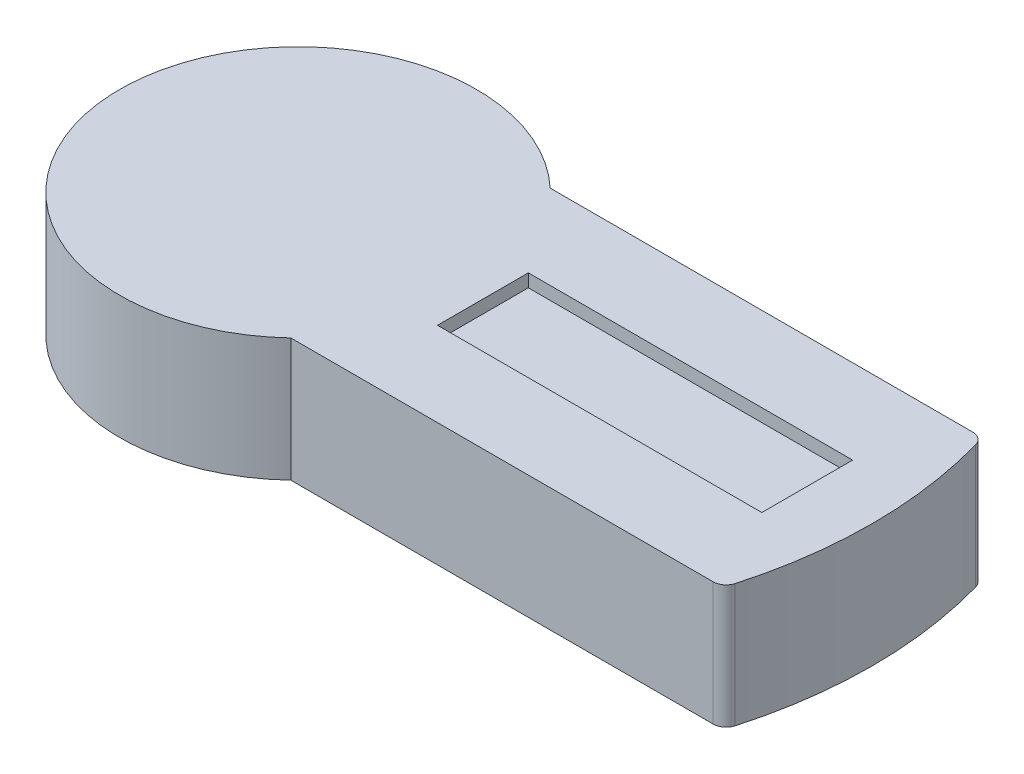
ISO-10303-21;
HEADER;
FILE_DESCRIPTION(('STEP AP214'),'2;1');
FILE_NAME('part.step','',(''),(''),'','','');
FILE_SCHEMA(('AUTOMOTIVE_DESIGN { 1 0 10303 214 1 1 1 1 }'));
ENDSEC;
DATA;
#1=APPLICATION_CONTEXT('core data for automotive mechanical design processes');
#2=APPLICATION_PROTOCOL_DEFINITION('international standard','automotive_design',2000,#1);
#3=PRODUCT_CONTEXT('',#1,'mechanical');
#4=PRODUCT('Part','Part','',(#3));
#5=PRODUCT_RELATED_PRODUCT_CATEGORY('part','',(#4));
#6=PRODUCT_DEFINITION_FORMATION('','',#4);
#7=PRODUCT_DEFINITION_CONTEXT('part definition',#1,'design');
#8=PRODUCT_DEFINITION('design','',#6,#7);
#9=PRODUCT_DEFINITION_SHAPE('','',#8);
#10=(LENGTH_UNIT() NAMED_UNIT(*) SI_UNIT(.MILLI.,.METRE.));
#11=(NAMED_UNIT(*) PLANE_ANGLE_UNIT() SI_UNIT($,.RADIAN.));
#12=(NAMED_UNIT(*) SI_UNIT($,.STERADIAN.) SOLID_ANGLE_UNIT());
#13=UNCERTAINTY_MEASURE_WITH_UNIT(LENGTH_MEASURE(1.E-05),#10,'distance_accuracy_value','');
#14=(GEOMETRIC_REPRESENTATION_CONTEXT(3) GLOBAL_UNCERTAINTY_ASSIGNED_CONTEXT((#13)) GLOBAL_UNIT_ASSIGNED_CONTEXT((#10,
#11,#12)) REPRESENTATION_CONTEXT('',''));
#15=CARTESIAN_POINT('',(0.,0.,0.));
#16=DIRECTION('',(0.,0.,1.));
#17=DIRECTION('',(1.,0.,0.));
#18=AXIS2_PLACEMENT_3D('',#15,#16,#17);
#19=CARTESIAN_POINT('',(0.,9.5,0.));
#20=DIRECTION('',(0.,-1.,0.));
#21=DIRECTION('',(0.,0.,-1.));
#22=AXIS2_PLACEMENT_3D('',#19,#20,#21);
#23=CYLINDRICAL_SURFACE('',#22,13.75);
#24=CARTESIAN_POINT('',(-13.6037678604128,4.5,-2.));
#25=CARTESIAN_POINT('',(-13.6037696828469,4.61170147451788,-1.99999535765154));
#26=CARTESIAN_POINT('',(-13.6051585235321,4.72346876317593,-1.99061045402893));
#27=CARTESIAN_POINT('',(-13.610560390175,4.94388126027463,-1.95332717006911));
#28=CARTESIAN_POINT('',(-13.614576011285,5.05252327013628,-1.9254104806757));
#29=CARTESIAN_POINT('',(-13.6247672106777,5.26346273426917,-1.85191408162582));
#30=CARTESIAN_POINT('',(-13.6309411684424,5.36576488096949,-1.80634762097101));
#31=CARTESIAN_POINT('',(-13.6447514639797,5.56125576556667,-1.69887582800239));
#32=CARTESIAN_POINT('',(-13.6523875909421,5.65444581428902,-1.63697285053976));
#33=CARTESIAN_POINT('',(-13.6683261760088,5.82978470161016,-1.49808684531119));
#34=CARTESIAN_POINT('',(-13.6766327766434,5.91185492507913,-1.42100503184549));
#35=CARTESIAN_POINT('',(-13.692939341013,6.06194363847953,-1.2541626457891));
#36=CARTESIAN_POINT('',(-13.7009392881916,6.12996137057538,-1.16440138984916));
#37=CARTESIAN_POINT('',(-13.715774351691,6.25030296803685,-0.974246137399993));
#38=CARTESIAN_POINT('',(-13.7226040510381,6.30255465914859,-0.873806006100224));
#39=CARTESIAN_POINT('',(-13.7342832774787,6.38941795276065,-0.665459478823011));
#40=CARTESIAN_POINT('',(-13.7391329030898,6.42403043291188,-0.557553454619611));
#41=CARTESIAN_POINT('',(-13.7462763438899,6.47439507307044,-0.338146948151338));
#42=CARTESIAN_POINT('',(-13.7485879705999,6.49027872984307,-0.226677240162864));
#43=CARTESIAN_POINT('',(-13.7504559602361,6.50314299966665,-0.00263235495397366));
#44=CARTESIAN_POINT('',(-13.7500124676143,6.50012460375963,0.109942764000324));
#45=CARTESIAN_POINT('',(-13.7464344541793,6.47537453464448,0.33210621334946));
#46=CARTESIAN_POINT('',(-13.7433202762861,6.45378432135685,0.441710677114492));
#47=CARTESIAN_POINT('',(-13.7347734835498,6.39272535268885,0.655724208207444));
#48=CARTESIAN_POINT('',(-13.7293408119595,6.35325615970269,0.760133148300336));
#49=CARTESIAN_POINT('',(-13.7167324401517,6.25741371072513,0.96122191355512));
#50=CARTESIAN_POINT('',(-13.7095505833803,6.20098057923809,1.05787279927889));
#51=CARTESIAN_POINT('',(-13.6942448666419,6.07285586457755,1.24038631129749));
#52=CARTESIAN_POINT('',(-13.6861209483325,6.00116333615251,1.32624826874212));
#53=CARTESIAN_POINT('',(-13.6697490406875,5.84376603137261,1.48557995150402));
#54=CARTESIAN_POINT('',(-13.6615005987712,5.75793778872673,1.55892771622802));
#55=CARTESIAN_POINT('',(-13.6458827551655,5.57512578282359,1.69019745389173));
#56=CARTESIAN_POINT('',(-13.6385133582954,5.47814195841381,1.74811934226433));
#57=CARTESIAN_POINT('',(-13.6254881867745,5.2756482899756,1.84690774655303));
#58=CARTESIAN_POINT('',(-13.6198336180394,5.17013251177875,1.88776226780075));
#59=CARTESIAN_POINT('',(-13.6109000699534,4.95363666543009,1.95113638111025));
#60=CARTESIAN_POINT('',(-13.6076209336494,4.84265695881666,1.97365718455692));
#61=CARTESIAN_POINT('',(-13.6038391074986,4.61946711009799,1.99955843933569));
#62=CARTESIAN_POINT('',(-13.6033113756213,4.50727741254294,2.00311153325654));
#63=CARTESIAN_POINT('',(-13.6050256766539,4.28390419456715,1.9914341078429));
#64=CARTESIAN_POINT('',(-13.6072676289206,4.1727206449459,1.97620413540482));
#65=CARTESIAN_POINT('',(-13.6142457139645,3.95504724747671,1.92753912095453));
#66=CARTESIAN_POINT('',(-13.6189701240093,3.84853786703674,1.89418961854083));
#67=CARTESIAN_POINT('',(-13.6303711708037,3.6426211915255,1.8103210122416));
#68=CARTESIAN_POINT('',(-13.6370478986438,3.54321422810541,1.75980110720818));
#69=CARTESIAN_POINT('',(-13.6516604770362,3.35354887459301,1.64260909382076));
#70=CARTESIAN_POINT('',(-13.6596049238185,3.2633603872903,1.57582494389196));
#71=CARTESIAN_POINT('',(-13.6758317056166,3.09540964992338,1.42815646147857));
#72=CARTESIAN_POINT('',(-13.6841140585458,3.01764805972209,1.34727138071711));
#73=CARTESIAN_POINT('',(-13.7001614515876,2.87614110931461,1.17293793943112));
#74=CARTESIAN_POINT('',(-13.7079219456001,2.81250997540889,1.0793963812061));
#75=CARTESIAN_POINT('',(-13.7219811196637,2.70186494935789,0.882851777147455));
#76=CARTESIAN_POINT('',(-13.728279837738,2.65485062496658,0.779848977512921));
#77=CARTESIAN_POINT('',(-13.7386857998428,2.57895749320421,0.56766683730455));
#78=CARTESIAN_POINT('',(-13.742800666558,2.55001554129795,0.458510471781478));
#79=CARTESIAN_POINT('',(-13.7484072260598,2.51088413075407,0.236822978136391));
#80=CARTESIAN_POINT('',(-13.7498990813147,2.50069351066479,0.124292059471965));
#81=CARTESIAN_POINT('',(-13.750090067362,2.49938108993855,-0.0998409077402428));
#82=CARTESIAN_POINT('',(-13.7488148327678,2.50808425562927,-0.211441949207725));
#83=CARTESIAN_POINT('',(-13.7436664644928,2.54393804943315,-0.431576028984442));
#84=CARTESIAN_POINT('',(-13.7397933377064,2.57108862859,-0.540109075434818));
#85=CARTESIAN_POINT('',(-13.729882325212,2.64300579441946,-0.750983084659956));
#86=CARTESIAN_POINT('',(-13.7238458410478,2.68776097767429,-0.853328006392713));
#87=CARTESIAN_POINT('',(-13.7102721845596,2.79359839880604,-1.04908313807524));
#88=CARTESIAN_POINT('',(-13.7027349694016,2.85468110272394,-1.14249309288839));
#89=CARTESIAN_POINT('',(-13.6869153274344,2.99207556407474,-1.31861589391602));
#90=CARTESIAN_POINT('',(-13.6786269185731,3.06851678883439,-1.40122721328148));
#91=CARTESIAN_POINT('',(-13.6622840226441,3.23418621462434,-1.55251429750274));
#92=CARTESIAN_POINT('',(-13.6542295910041,3.32341741628073,-1.62118678304171));
#93=CARTESIAN_POINT('',(-13.6392212044936,3.51268413794729,-1.74296896599119));
#94=CARTESIAN_POINT('',(-13.6322732651998,3.61277405500097,-1.79599484512115));
#95=CARTESIAN_POINT('',(-13.6203350006855,3.82049135629695,-1.88440496611452));
#96=CARTESIAN_POINT('',(-13.6153426259364,3.92811070909531,-1.91980768851835));
#97=CARTESIAN_POINT('',(-13.6090457382164,4.11352373508645,-1.96384515631823));
#98=CARTESIAN_POINT('',(-13.6070769015304,4.19016709723434,-1.97738272598923));
#99=CARTESIAN_POINT('',(-13.604437336021,4.34452968570156,-1.99546171045604));
#100=CARTESIAN_POINT('',(-13.6037665918865,4.42224889932032,-2.00000323136023));
#101=CARTESIAN_POINT('',(-13.6037678604128,4.5,-2.));
#102=B_SPLINE_CURVE_WITH_KNOTS('',3,(#24,#25,#26,#27,#28,#29,#30,#31,#32,#33,#34,#35,#36,#37,
#38,#39,#40,#41,#42,#43,#44,#45,#46,#47,#48,#49,#50,#51,#52,#53,#54,#55,#56,#57,#58,#59,#60,#61,
#62,#63,#64,#65,#66,#67,#68,#69,#70,#71,#72,#73,#74,#75,#76,#77,#78,#79,#80,#81,#82,#83,#84,#85,
#86,#87,#88,#89,#90,#91,#92,#93,#94,#95,#96,#97,#98,#99,#100,#101),.UNSPECIFIED.,.T.,.F.,(4,2,2,
2,2,2,2,2,2,2,2,2,2,2,2,2,2,2,2,2,2,2,2,2,2,2,2,2,2,2,2,2,2,2,2,2,2,2,4),(0.,0.334820265461426,
0.669971820365651,1.00487227599159,1.33972448324323,1.67683261336209,2.0139589186132,
2.35260589974262,2.69123602961626,3.02747417523755,3.36369469190866,3.69737669670614,
4.03106686914351,4.36594893825539,4.70085175785745,5.03885209035526,5.37685427578681,
5.7150936056712,6.05331058486375,6.38844382459525,6.7235673066632,7.05712229576479,
7.39069285023057,7.72662975962063,8.06258450119358,8.40116341082857,8.73973351250525,
9.07711393835335,9.41447346625945,9.74872101259897,10.0829676719057,10.4169981778598,
10.7510382191581,11.0880221059806,11.4250851815886,11.7639224096614,12.1024035632571,
12.3354618227144,12.5685173332333),.UNSPECIFIED.);
#103=CARTESIAN_POINT('',(-13.6037678604128,4.5,-2.));
#104=VERTEX_POINT('',#103);
#105=EDGE_CURVE('E182',#104,#104,#102,.T.);
#106=ORIENTED_EDGE('',*,*,#105,.T.);
#107=EDGE_LOOP('',(#106));
#108=FACE_BOUND('',#107,.T.);
#109=CARTESIAN_POINT('',(0.,9.5,0.));
#110=DIRECTION('',(0.,1.,0.));
#111=DIRECTION('',(0.,0.,1.));
#112=AXIS2_PLACEMENT_3D('',#109,#110,#111);
#113=CIRCLE('',#112,13.75);
#114=CARTESIAN_POINT('',(9.43729304408843,9.5,-10.));
#115=VERTEX_POINT('',#114);
#116=CARTESIAN_POINT('',(9.43729304408843,9.5,10.));
#117=VERTEX_POINT('',#116);
#118=EDGE_CURVE('E242',#115,#117,#113,.T.);
#119=ORIENTED_EDGE('',*,*,#118,.F.);
#120=DIRECTION('',(0.,-1.,0.));
#121=VECTOR('',#120,1.);
#122=CARTESIAN_POINT('',(9.43729304408843,9.5,-10.));
#123=LINE('',#122,#121);
#124=CARTESIAN_POINT('',(9.43729304408843,0.,-10.));
#125=VERTEX_POINT('',#124);
#126=EDGE_CURVE('E262',#115,#125,#123,.T.);
#127=ORIENTED_EDGE('',*,*,#126,.T.);
#128=CARTESIAN_POINT('',(0.,0.,0.));
#129=DIRECTION('',(0.,1.,0.));
#130=DIRECTION('',(0.,0.,1.));
#131=AXIS2_PLACEMENT_3D('',#128,#129,#130);
#132=CIRCLE('',#131,13.75);
#133=CARTESIAN_POINT('',(9.43729304408843,0.,10.));
#134=VERTEX_POINT('',#133);
#135=EDGE_CURVE('E237',#125,#134,#132,.T.);
#136=ORIENTED_EDGE('',*,*,#135,.T.);
#137=DIRECTION('',(0.,-1.,0.));
#138=VECTOR('',#137,1.);
#139=CARTESIAN_POINT('',(9.43729304408843,9.5,10.));
#140=LINE('',#139,#138);
#141=EDGE_CURVE('E265',#117,#134,#140,.T.);
#142=ORIENTED_EDGE('',*,*,#141,.F.);
#143=EDGE_LOOP('',(#119,#127,#136,#142));
#144=FACE_BOUND('',#143,.T.);
#145=ADVANCED_FACE('F49',(#108,#144),#23,.T.);
#146=CARTESIAN_POINT('',(0.,9.5,0.));
#147=DIRECTION('',(0.,1.,0.));
#148=DIRECTION('',(0.,0.,1.));
#149=AXIS2_PLACEMENT_3D('',#146,#147,#148);
#150=PLANE('',#149);
#151=CARTESIAN_POINT('',(10.1666666666667,9.5,0.));
#152=DIRECTION('',(0.,-1.,0.));
#153=DIRECTION('',(0.,0.,-1.));
#154=AXIS2_PLACEMENT_3D('',#151,#152,#153);
#155=CIRCLE('',#154,34.0833333333333);
#156=CARTESIAN_POINT('',(42.9645763522586,9.5,-9.272040302267));
#157=VERTEX_POINT('',#156);
#158=CARTESIAN_POINT('',(42.9645763522586,9.5,9.272040302267));
#159=VERTEX_POINT('',#158);
#160=EDGE_CURVE('E159',#157,#159,#155,.T.);
#161=ORIENTED_EDGE('',*,*,#160,.F.);
#162=CARTESIAN_POINT('',(42.0022904935127,9.5,-9.));
#163=DIRECTION('',(0.,1.,0.));
#164=DIRECTION('',(0.,0.,1.));
#165=AXIS2_PLACEMENT_3D('',#162,#163,#164);
#166=CIRCLE('',#165,1.);
#167=CARTESIAN_POINT('',(42.0022904935127,9.5,-10.));
#168=VERTEX_POINT('',#167);
#169=EDGE_CURVE('E247',#157,#168,#166,.T.);
#170=ORIENTED_EDGE('',*,*,#169,.T.);
#171=DIRECTION('',(1.,0.,0.));
#172=VECTOR('',#171,1.);
#173=CARTESIAN_POINT('',(0.,9.5,-10.));
#174=LINE('',#173,#172);
#175=EDGE_CURVE('E259',#115,#168,#174,.T.);
#176=ORIENTED_EDGE('',*,*,#175,.F.);
#177=ORIENTED_EDGE('',*,*,#118,.T.);
#178=DIRECTION('',(1.,0.,0.));
#179=VECTOR('',#178,1.);
#180=CARTESIAN_POINT('',(0.,9.5,10.));
#181=LINE('',#180,#179);
#182=CARTESIAN_POINT('',(42.0022904935127,9.5,10.));
#183=VERTEX_POINT('',#182);
#184=EDGE_CURVE('E236',#117,#183,#181,.T.);
#185=ORIENTED_EDGE('',*,*,#184,.T.);
#186=CARTESIAN_POINT('',(42.0022904935127,9.5,9.));
#187=DIRECTION('',(0.,1.,0.));
#188=DIRECTION('',(0.,0.,1.));
#189=AXIS2_PLACEMENT_3D('',#186,#187,#188);
#190=CIRCLE('',#189,1.);
#191=EDGE_CURVE('E245',#183,#159,#190,.T.);
#192=ORIENTED_EDGE('',*,*,#191,.T.);
#193=EDGE_LOOP('',(#161,#170,#176,#177,#185,#192));
#194=FACE_BOUND('',#193,.T.);
#195=DIRECTION('',(0.,0.,1.));
#196=VECTOR('',#195,1.);
#197=CARTESIAN_POINT('',(14.25,9.5,-3.5));
#198=LINE('',#197,#196);
#199=CARTESIAN_POINT('',(14.25,9.5,-3.5));
#200=VERTEX_POINT('',#199);
#201=CARTESIAN_POINT('',(14.25,9.5,3.5));
#202=VERTEX_POINT('',#201);
#203=EDGE_CURVE('E136',#200,#202,#198,.T.);
#204=ORIENTED_EDGE('',*,*,#203,.F.);
#205=DIRECTION('',(1.,0.,0.));
#206=VECTOR('',#205,1.);
#207=CARTESIAN_POINT('',(14.25,9.5,-3.5));
#208=LINE('',#207,#206);
#209=CARTESIAN_POINT('',(39.25,9.5,-3.5));
#210=VERTEX_POINT('',#209);
#211=EDGE_CURVE('E153',#200,#210,#208,.T.);
#212=ORIENTED_EDGE('',*,*,#211,.T.);
#213=DIRECTION('',(0.,0.,1.));
#214=VECTOR('',#213,1.);
#215=CARTESIAN_POINT('',(39.25,9.5,-3.5));
#216=LINE('',#215,#214);
#217=CARTESIAN_POINT('',(39.25,9.5,3.5));
#218=VERTEX_POINT('',#217);
#219=EDGE_CURVE('E156',#210,#218,#216,.T.);
#220=ORIENTED_EDGE('',*,*,#219,.T.);
#221=DIRECTION('',(1.,0.,0.));
#222=VECTOR('',#221,1.);
#223=CARTESIAN_POINT('',(14.25,9.5,3.5));
#224=LINE('',#223,#222);
#225=EDGE_CURVE('E165',#202,#218,#224,.T.);
#226=ORIENTED_EDGE('',*,*,#225,.F.);
#227=EDGE_LOOP('',(#204,#212,#220,#226));
#228=FACE_BOUND('',#227,.T.);
#229=ADVANCED_FACE('F217',(#194,#228),#150,.T.);
#230=CARTESIAN_POINT('',(0.,0.,0.));
#231=DIRECTION('',(0.,1.,0.));
#232=DIRECTION('',(0.,0.,1.));
#233=AXIS2_PLACEMENT_3D('',#230,#231,#232);
#234=PLANE('',#233);
#235=DIRECTION('',(1.,0.,0.));
#236=VECTOR('',#235,1.);
#237=CARTESIAN_POINT('',(0.,0.,-10.));
#238=LINE('',#237,#236);
#239=CARTESIAN_POINT('',(42.0022904935127,0.,-10.));
#240=VERTEX_POINT('',#239);
#241=EDGE_CURVE('E183',#125,#240,#238,.T.);
#242=ORIENTED_EDGE('',*,*,#241,.T.);
#243=CARTESIAN_POINT('',(42.0022904935127,0.,-9.));
#244=DIRECTION('',(0.,1.,0.));
#245=DIRECTION('',(0.,0.,1.));
#246=AXIS2_PLACEMENT_3D('',#243,#244,#245);
#247=CIRCLE('',#246,1.);
#248=CARTESIAN_POINT('',(42.9645763522586,0.,-9.272040302267));
#249=VERTEX_POINT('',#248);
#250=EDGE_CURVE('E57',#240,#249,#247,.F.);
#251=ORIENTED_EDGE('',*,*,#250,.T.);
#252=CARTESIAN_POINT('',(10.1666666666667,0.,0.));
#253=DIRECTION('',(0.,-1.,0.));
#254=DIRECTION('',(0.,0.,-1.));
#255=AXIS2_PLACEMENT_3D('',#252,#253,#254);
#256=CIRCLE('',#255,34.0833333333333);
#257=CARTESIAN_POINT('',(42.9645763522586,0.,9.272040302267));
#258=VERTEX_POINT('',#257);
#259=EDGE_CURVE('E166',#249,#258,#256,.T.);
#260=ORIENTED_EDGE('',*,*,#259,.T.);
#261=CARTESIAN_POINT('',(42.0022904935127,0.,9.));
#262=DIRECTION('',(0.,1.,0.));
#263=DIRECTION('',(0.,0.,1.));
#264=AXIS2_PLACEMENT_3D('',#261,#262,#263);
#265=CIRCLE('',#264,1.);
#266=CARTESIAN_POINT('',(42.0022904935127,0.,10.));
#267=VERTEX_POINT('',#266);
#268=EDGE_CURVE('E64',#258,#267,#265,.F.);
#269=ORIENTED_EDGE('',*,*,#268,.T.);
#270=DIRECTION('',(1.,0.,0.));
#271=VECTOR('',#270,1.);
#272=CARTESIAN_POINT('',(0.,0.,10.));
#273=LINE('',#272,#271);
#274=EDGE_CURVE('E263',#134,#267,#273,.T.);
#275=ORIENTED_EDGE('',*,*,#274,.F.);
#276=ORIENTED_EDGE('',*,*,#135,.F.);
#277=EDGE_LOOP('',(#242,#251,#260,#269,#275,#276));
#278=FACE_BOUND('',#277,.T.);
#279=ADVANCED_FACE('F224',(#278),#234,.F.);
#280=CARTESIAN_POINT('',(0.,58.0598857082675,-10.));
#281=DIRECTION('',(0.,0.,-1.));
#282=DIRECTION('',(-1.,0.,0.));
#283=AXIS2_PLACEMENT_3D('',#280,#281,#282);
#284=PLANE('',#283);
#285=ORIENTED_EDGE('',*,*,#175,.T.);
#286=DIRECTION('',(0.,-1.,0.));
#287=VECTOR('',#286,1.);
#288=CARTESIAN_POINT('',(42.0022904935127,0.,-10.));
#289=LINE('',#288,#287);
#290=EDGE_CURVE('E72',#168,#240,#289,.T.);
#291=ORIENTED_EDGE('',*,*,#290,.T.);
#292=ORIENTED_EDGE('',*,*,#241,.F.);
#293=ORIENTED_EDGE('',*,*,#126,.F.);
#294=EDGE_LOOP('',(#285,#291,#292,#293));
#295=FACE_BOUND('',#294,.T.);
#296=ADVANCED_FACE('F261',(#295),#284,.T.);
#297=CARTESIAN_POINT('',(0.,58.0598857082675,10.));
#298=DIRECTION('',(0.,0.,-1.));
#299=DIRECTION('',(-1.,0.,0.));
#300=AXIS2_PLACEMENT_3D('',#297,#298,#299);
#301=PLANE('',#300);
#302=ORIENTED_EDGE('',*,*,#274,.T.);
#303=DIRECTION('',(0.,1.,0.));
#304=VECTOR('',#303,1.);
#305=CARTESIAN_POINT('',(42.0022904935127,58.0598857082675,10.));
#306=LINE('',#305,#304);
#307=EDGE_CURVE('E14',#267,#183,#306,.T.);
#308=ORIENTED_EDGE('',*,*,#307,.T.);
#309=ORIENTED_EDGE('',*,*,#184,.F.);
#310=ORIENTED_EDGE('',*,*,#141,.T.);
#311=EDGE_LOOP('',(#302,#308,#309,#310));
#312=FACE_BOUND('',#311,.T.);
#313=ADVANCED_FACE('F273',(#312),#301,.F.);
#314=CARTESIAN_POINT('',(-18.751,4.5,0.));
#315=DIRECTION('',(1.,0.,0.));
#316=DIRECTION('',(0.,0.,-1.));
#317=AXIS2_PLACEMENT_3D('',#314,#315,#316);
#318=CYLINDRICAL_SURFACE('',#317,2.);
#319=CARTESIAN_POINT('',(-16.1264534228701,4.5,-2.));
#320=CARTESIAN_POINT('',(-16.1264550083052,4.38811653582872,-1.99999523491535));
#321=CARTESIAN_POINT('',(-16.1276303449416,4.27616280039642,-1.99057989322956));
#322=CARTESIAN_POINT('',(-16.1322030151056,4.05537002507787,-1.95316853651219));
#323=CARTESIAN_POINT('',(-16.1356026812274,3.94653438024822,-1.92515301552012));
#324=CARTESIAN_POINT('',(-16.1442332388205,3.73520653078661,-1.85137885723158));
#325=CARTESIAN_POINT('',(-16.1494628984566,3.63271011346847,-1.80563215321424));
#326=CARTESIAN_POINT('',(-16.1611627055368,3.43686845212759,-1.69771953981187));
#327=CARTESIAN_POINT('',(-16.1676326379701,3.34352162618651,-1.63555647562323));
#328=CARTESIAN_POINT('',(-16.1811233384656,3.16810269241689,-1.49621407056932));
#329=CARTESIAN_POINT('',(-16.1881466251092,3.08608744319867,-1.4189633860959));
#330=CARTESIAN_POINT('',(-16.2019300204907,2.93615079674028,-1.25179210634181));
#331=CARTESIAN_POINT('',(-16.2086901162137,2.8682300957637,-1.16187088551126));
#332=CARTESIAN_POINT('',(-16.2212111589571,2.74820716099504,-0.971554361813393));
#333=CARTESIAN_POINT('',(-16.2269688356301,2.69615630180599,-0.871126426137084));
#334=CARTESIAN_POINT('',(-16.2368086453089,2.60967960756243,-0.662872163031896));
#335=CARTESIAN_POINT('',(-16.2408908386829,2.57525313748248,-0.555046102324085));
#336=CARTESIAN_POINT('',(-16.2469019957791,2.52517211505083,-0.335637409118634));
#337=CARTESIAN_POINT('',(-16.2488417904769,2.50942310796287,-0.224076637819277));
#338=CARTESIAN_POINT('',(-16.2503865615351,2.49685137868665,0.000120115068125403));
#339=CARTESIAN_POINT('',(-16.2499916270997,2.5000279333997,0.112756055412465));
#340=CARTESIAN_POINT('',(-16.2469202101726,2.52514137715167,0.335263306847503));
#341=CARTESIAN_POINT('',(-16.2442560819133,2.54697668393334,0.445146277603352));
#342=CARTESIAN_POINT('',(-16.2369595234422,2.6086290595095,0.659676242160634));
#343=CARTESIAN_POINT('',(-16.2323270567803,2.6484464613003,0.764323138959459));
#344=CARTESIAN_POINT('',(-16.2215930802597,2.74504106547599,0.965725377056043));
#345=CARTESIAN_POINT('',(-16.2154877634145,2.8018623120261,1.06245938317903));
#346=CARTESIAN_POINT('',(-16.2024913120445,2.9308196240385,1.24505717563188));
#347=CARTESIAN_POINT('',(-16.1956001425833,3.00295637049849,1.33092047832909));
#348=CARTESIAN_POINT('',(-16.1817494756979,3.1610661298691,1.48993615771035));
#349=CARTESIAN_POINT('',(-16.1747898280886,3.24712765878959,1.56300053777561));
#350=CARTESIAN_POINT('',(-16.1616317097586,3.43033970149707,1.69366065698613));
#351=CARTESIAN_POINT('',(-16.1554332412945,3.5274902481567,1.75125635027381));
#352=CARTESIAN_POINT('',(-16.144499313007,3.73020007689047,1.84934873748473));
#353=CARTESIAN_POINT('',(-16.1397644448626,3.83576273803408,1.88983851854619));
#354=CARTESIAN_POINT('',(-16.1323054165133,4.05226014163651,1.95249239952828));
#355=CARTESIAN_POINT('',(-16.1295811624652,4.16319463311354,1.97465735474564));
#356=CARTESIAN_POINT('',(-16.1264688971559,4.38650988889018,1.99991614702911));
#357=CARTESIAN_POINT('',(-16.1260657234509,4.49887644979955,2.00313376066061));
#358=CARTESIAN_POINT('',(-16.1276011748319,4.72254703457505,1.99073299232264));
#359=CARTESIAN_POINT('',(-16.1295397515652,4.83385108033231,1.97511499927328));
#360=CARTESIAN_POINT('',(-16.1355264429296,5.05186704942843,1.92559051661824));
#361=CARTESIAN_POINT('',(-16.1395676564784,5.1585927663608,1.89174384283838));
#362=CARTESIAN_POINT('',(-16.1492986831949,5.36485381497622,1.80678431223724));
#363=CARTESIAN_POINT('',(-16.1549885526072,5.4643889012028,1.75567086634216));
#364=CARTESIAN_POINT('',(-16.1674121389239,5.65400361068549,1.63732390114933));
#365=CARTESIAN_POINT('',(-16.174151054141,5.74403218115088,1.57000913998199));
#366=CARTESIAN_POINT('',(-16.1878970473473,5.91155764338068,1.42128534299878));
#367=CARTESIAN_POINT('',(-16.194904135435,5.98905406264944,1.3398757760105));
#368=CARTESIAN_POINT('',(-16.2084434612257,6.12974951771392,1.16473289592667));
#369=CARTESIAN_POINT('',(-16.2149728641961,6.19286726924281,1.07093403530689));
#370=CARTESIAN_POINT('',(-16.2267788384992,6.3024515337712,0.873994360631562));
#371=CARTESIAN_POINT('',(-16.2320554344221,6.34891837360466,0.770853729991603));
#372=CARTESIAN_POINT('',(-16.2407486649568,6.4237472673842,0.558429554765495));
#373=CARTESIAN_POINT('',(-16.2441701405249,6.45215647665594,0.449162827488097));
#374=CARTESIAN_POINT('',(-16.2487877054915,6.49021712078856,0.227365382034081));
#375=CARTESIAN_POINT('',(-16.2499838920235,6.49986937438688,0.11483480654142));
#376=CARTESIAN_POINT('',(-16.2500156785927,6.50012713853134,-0.109501931532752));
#377=CARTESIAN_POINT('',(-16.2488668212153,6.49085805671002,-0.221307968593219));
#378=CARTESIAN_POINT('',(-16.2443684778583,6.45380164983469,-0.441760504163856));
#379=CARTESIAN_POINT('',(-16.2410189930877,6.42601433495377,-0.550407004409699));
#380=CARTESIAN_POINT('',(-16.2324941241712,6.35274924363819,-0.761441240593303));
#381=CARTESIAN_POINT('',(-16.2273193402137,6.30727728170285,-0.863831020875175));
#382=CARTESIAN_POINT('',(-16.2157171988056,6.19994667273062,-1.05954625191041));
#383=CARTESIAN_POINT('',(-16.2092898283099,6.13808785503045,-1.15287160824718));
#384=CARTESIAN_POINT('',(-16.1958493440343,5.99927485963108,-1.32844975381836));
#385=CARTESIAN_POINT('',(-16.1888327706417,5.92222734027016,-1.41062848590527));
#386=CARTESIAN_POINT('',(-16.1750325956517,5.7554174156885,-1.56093988128044));
#387=CARTESIAN_POINT('',(-16.1682490496844,5.66565200021087,-1.62906920974954));
#388=CARTESIAN_POINT('',(-16.1556558972015,5.47556986672234,-1.74956500030141));
#389=CARTESIAN_POINT('',(-16.1498500338557,5.37521488700036,-1.80187146497581));
#390=CARTESIAN_POINT('',(-16.1399135200178,5.16713084101248,-1.8888154222938));
#391=CARTESIAN_POINT('',(-16.1357810428042,5.05940996661524,-1.92347219261523));
#392=CARTESIAN_POINT('',(-16.1306658953909,4.87593912476245,-1.96580643380904));
#393=CARTESIAN_POINT('',(-16.1290940515084,4.80134786424601,-1.97861066011405));
#394=CARTESIAN_POINT('',(-16.1269872833248,4.65118176103669,-1.99570902232761));
#395=CARTESIAN_POINT('',(-16.1264523514887,4.57560692549532,-2.00000322007728));
#396=CARTESIAN_POINT('',(-16.1264534228701,4.5,-2.));
#397=B_SPLINE_CURVE_WITH_KNOTS('',3,(#319,#320,#321,#322,#323,#324,#325,#326,#327,#328,#329,
#330,#331,#332,#333,#334,#335,#336,#337,#338,#339,#340,#341,#342,#343,#344,#345,#346,#347,#348,
#349,#350,#351,#352,#353,#354,#355,#356,#357,#358,#359,#360,#361,#362,#363,#364,#365,#366,#367,
#368,#369,#370,#371,#372,#373,#374,#375,#376,#377,#378,#379,#380,#381,#382,#383,#384,#385,#386,
#387,#388,#389,#390,#391,#392,#393,#394,#395,#396),.UNSPECIFIED.,.T.,.F.,(4,2,2,2,2,2,2,2,2,2,2,
2,2,2,2,2,2,2,2,2,2,2,2,2,2,2,2,2,2,2,2,2,2,2,2,2,2,2,4),(0.,0.335374196513832,
0.671100655800971,1.00660155876321,1.3420443526076,1.67911350632473,2.01619930712665,
2.35436502685567,2.69251856125728,3.02895460945889,3.36537780335742,3.6999810215811,
4.03459043631322,4.37007418685023,4.70557285766589,5.04329464663325,5.38101743678012,
5.7188765776163,6.05671994825436,6.39235383254361,6.72798078673866,7.06251306150709,
7.39705675034302,7.73331431105555,8.06958454662406,8.40771102414389,8.74583086435328,
9.08306407802911,9.42028257121077,9.75527329092502,10.0902638266106,10.4251443144226,
10.7600282900328,11.0970383208548,11.4341282537992,11.7724807948214,12.1104629772336,
12.3370987570734,12.5637328899785),.UNSPECIFIED.);
#398=CARTESIAN_POINT('',(-16.1264534228701,4.5,-2.));
#399=VERTEX_POINT('',#398);
#400=EDGE_CURVE('E172',#399,#399,#397,.T.);
#401=ORIENTED_EDGE('',*,*,#400,.F.);
#402=EDGE_LOOP('',(#401));
#403=FACE_BOUND('',#402,.T.);
#404=ORIENTED_EDGE('',*,*,#105,.F.);
#405=EDGE_LOOP('',(#404));
#406=FACE_BOUND('',#405,.T.);
#407=ADVANCED_FACE('F185',(#403,#406),#318,.T.);
#408=CARTESIAN_POINT('',(0.,9.5,0.));
#409=DIRECTION('',(0.,-1.,0.));
#410=DIRECTION('',(0.,0.,-1.));
#411=AXIS2_PLACEMENT_3D('',#408,#409,#410);
#412=CYLINDRICAL_SURFACE('',#411,16.25);
#413=ORIENTED_EDGE('',*,*,#400,.T.);
#414=EDGE_LOOP('',(#413));
#415=FACE_BOUND('',#414,.T.);
#416=ADVANCED_FACE('F188',(#415),#412,.T.);
#417=CARTESIAN_POINT('',(14.25,8.5,-3.5));
#418=DIRECTION('',(-1.,0.,0.));
#419=DIRECTION('',(0.,0.,1.));
#420=AXIS2_PLACEMENT_3D('',#417,#418,#419);
#421=PLANE('',#420);
#422=ORIENTED_EDGE('',*,*,#203,.T.);
#423=DIRECTION('',(0.,1.,0.));
#424=VECTOR('',#423,1.);
#425=CARTESIAN_POINT('',(14.25,8.5,3.5));
#426=LINE('',#425,#424);
#427=CARTESIAN_POINT('',(14.25,8.5,3.5));
#428=VERTEX_POINT('',#427);
#429=EDGE_CURVE('E130',#428,#202,#426,.T.);
#430=ORIENTED_EDGE('',*,*,#429,.F.);
#431=DIRECTION('',(0.,0.,1.));
#432=VECTOR('',#431,1.);
#433=CARTESIAN_POINT('',(14.25,8.5,-3.5));
#434=LINE('',#433,#432);
#435=CARTESIAN_POINT('',(14.25,8.5,-3.5));
#436=VERTEX_POINT('',#435);
#437=EDGE_CURVE('E134',#436,#428,#434,.T.);
#438=ORIENTED_EDGE('',*,*,#437,.F.);
#439=DIRECTION('',(0.,1.,0.));
#440=VECTOR('',#439,1.);
#441=CARTESIAN_POINT('',(14.25,8.5,-3.5));
#442=LINE('',#441,#440);
#443=EDGE_CURVE('E170',#436,#200,#442,.T.);
#444=ORIENTED_EDGE('',*,*,#443,.T.);
#445=EDGE_LOOP('',(#422,#430,#438,#444));
#446=FACE_BOUND('',#445,.T.);
#447=ADVANCED_FACE('F132',(#446),#421,.F.);
#448=CARTESIAN_POINT('',(14.25,8.5,-3.5));
#449=DIRECTION('',(0.,0.,1.));
#450=DIRECTION('',(1.,0.,0.));
#451=AXIS2_PLACEMENT_3D('',#448,#449,#450);
#452=PLANE('',#451);
#453=ORIENTED_EDGE('',*,*,#211,.F.);
#454=ORIENTED_EDGE('',*,*,#443,.F.);
#455=DIRECTION('',(1.,0.,0.));
#456=VECTOR('',#455,1.);
#457=CARTESIAN_POINT('',(14.25,8.5,-3.5));
#458=LINE('',#457,#456);
#459=CARTESIAN_POINT('',(39.25,8.5,-3.5));
#460=VERTEX_POINT('',#459);
#461=EDGE_CURVE('E141',#436,#460,#458,.T.);
#462=ORIENTED_EDGE('',*,*,#461,.T.);
#463=DIRECTION('',(0.,1.,0.));
#464=VECTOR('',#463,1.);
#465=CARTESIAN_POINT('',(39.25,8.5,-3.5));
#466=LINE('',#465,#464);
#467=EDGE_CURVE('E173',#460,#210,#466,.T.);
#468=ORIENTED_EDGE('',*,*,#467,.T.);
#469=EDGE_LOOP('',(#453,#454,#462,#468));
#470=FACE_BOUND('',#469,.T.);
#471=ADVANCED_FACE('F195',(#470),#452,.T.);
#472=CARTESIAN_POINT('',(39.25,8.5,-3.5));
#473=DIRECTION('',(-1.,0.,0.));
#474=DIRECTION('',(0.,0.,1.));
#475=AXIS2_PLACEMENT_3D('',#472,#473,#474);
#476=PLANE('',#475);
#477=ORIENTED_EDGE('',*,*,#219,.F.);
#478=ORIENTED_EDGE('',*,*,#467,.F.);
#479=DIRECTION('',(0.,0.,1.));
#480=VECTOR('',#479,1.);
#481=CARTESIAN_POINT('',(39.25,8.5,-3.5));
#482=LINE('',#481,#480);
#483=CARTESIAN_POINT('',(39.25,8.5,3.5));
#484=VERTEX_POINT('',#483);
#485=EDGE_CURVE('E149',#460,#484,#482,.T.);
#486=ORIENTED_EDGE('',*,*,#485,.T.);
#487=DIRECTION('',(0.,1.,0.));
#488=VECTOR('',#487,1.);
#489=CARTESIAN_POINT('',(39.25,8.5,3.5));
#490=LINE('',#489,#488);
#491=EDGE_CURVE('E140',#484,#218,#490,.T.);
#492=ORIENTED_EDGE('',*,*,#491,.T.);
#493=EDGE_LOOP('',(#477,#478,#486,#492));
#494=FACE_BOUND('',#493,.T.);
#495=ADVANCED_FACE('F198',(#494),#476,.T.);
#496=CARTESIAN_POINT('',(14.25,8.5,3.5));
#497=DIRECTION('',(0.,0.,1.));
#498=DIRECTION('',(1.,0.,0.));
#499=AXIS2_PLACEMENT_3D('',#496,#497,#498);
#500=PLANE('',#499);
#501=ORIENTED_EDGE('',*,*,#225,.T.);
#502=ORIENTED_EDGE('',*,*,#491,.F.);
#503=DIRECTION('',(1.,0.,0.));
#504=VECTOR('',#503,1.);
#505=CARTESIAN_POINT('',(14.25,8.5,3.5));
#506=LINE('',#505,#504);
#507=EDGE_CURVE('E145',#428,#484,#506,.T.);
#508=ORIENTED_EDGE('',*,*,#507,.F.);
#509=ORIENTED_EDGE('',*,*,#429,.T.);
#510=EDGE_LOOP('',(#501,#502,#508,#509));
#511=FACE_BOUND('',#510,.T.);
#512=ADVANCED_FACE('F146',(#511),#500,.F.);
#513=CARTESIAN_POINT('',(0.,8.5,0.));
#514=DIRECTION('',(0.,1.,0.));
#515=DIRECTION('',(0.,0.,1.));
#516=AXIS2_PLACEMENT_3D('',#513,#514,#515);
#517=PLANE('',#516);
#518=ORIENTED_EDGE('',*,*,#437,.T.);
#519=ORIENTED_EDGE('',*,*,#507,.T.);
#520=ORIENTED_EDGE('',*,*,#485,.F.);
#521=ORIENTED_EDGE('',*,*,#461,.F.);
#522=EDGE_LOOP('',(#518,#519,#520,#521));
#523=FACE_BOUND('',#522,.T.);
#524=ADVANCED_FACE('F152',(#523),#517,.T.);
#525=CARTESIAN_POINT('',(10.1666666666667,0.,0.));
#526=DIRECTION('',(0.,1.,0.));
#527=DIRECTION('',(0.,0.,1.));
#528=AXIS2_PLACEMENT_3D('',#525,#526,#527);
#529=CYLINDRICAL_SURFACE('',#528,34.0833333333333);
#530=ORIENTED_EDGE('',*,*,#259,.F.);
#531=DIRECTION('',(0.,1.,0.));
#532=VECTOR('',#531,1.);
#533=CARTESIAN_POINT('',(42.9645763522586,0.,-9.272040302267));
#534=LINE('',#533,#532);
#535=EDGE_CURVE('E241',#249,#157,#534,.T.);
#536=ORIENTED_EDGE('',*,*,#535,.T.);
#537=ORIENTED_EDGE('',*,*,#160,.T.);
#538=DIRECTION('',(0.,1.,0.));
#539=VECTOR('',#538,1.);
#540=CARTESIAN_POINT('',(42.9645763522586,0.,9.272040302267));
#541=LINE('',#540,#539);
#542=EDGE_CURVE('E239',#159,#258,#541,.F.);
#543=ORIENTED_EDGE('',*,*,#542,.T.);
#544=EDGE_LOOP('',(#530,#536,#537,#543));
#545=FACE_BOUND('',#544,.T.);
#546=ADVANCED_FACE('F207',(#545),#529,.T.);
#547=CARTESIAN_POINT('',(42.0022904935127,0.,-9.));
#548=DIRECTION('',(0.,1.,0.));
#549=DIRECTION('',(0.,0.,1.));
#550=AXIS2_PLACEMENT_3D('',#547,#548,#549);
#551=CYLINDRICAL_SURFACE('',#550,1.);
#552=ORIENTED_EDGE('',*,*,#250,.F.);
#553=ORIENTED_EDGE('',*,*,#290,.F.);
#554=ORIENTED_EDGE('',*,*,#169,.F.);
#555=ORIENTED_EDGE('',*,*,#535,.F.);
#556=EDGE_LOOP('',(#552,#553,#554,#555));
#557=FACE_BOUND('',#556,.T.);
#558=ADVANCED_FACE('F209',(#557),#551,.T.);
#559=CARTESIAN_POINT('',(42.0022904935127,0.,9.));
#560=DIRECTION('',(0.,1.,0.));
#561=DIRECTION('',(0.,0.,1.));
#562=AXIS2_PLACEMENT_3D('',#559,#560,#561);
#563=CYLINDRICAL_SURFACE('',#562,1.);
#564=ORIENTED_EDGE('',*,*,#268,.F.);
#565=ORIENTED_EDGE('',*,*,#542,.F.);
#566=ORIENTED_EDGE('',*,*,#191,.F.);
#567=ORIENTED_EDGE('',*,*,#307,.F.);
#568=EDGE_LOOP('',(#564,#565,#566,#567));
#569=FACE_BOUND('',#568,.T.);
#570=ADVANCED_FACE('F51',(#569),#563,.T.);
#571=CLOSED_SHELL('',(#145,#229,#279,#296,#313,#407,#416,#447,#471,#495,#512,#524,#546,#558,#570));
#572=MANIFOLD_SOLID_BREP('B2',#571);
#573=ADVANCED_BREP_SHAPE_REPRESENTATION('',(#18,#572),#14);
#574=SHAPE_DEFINITION_REPRESENTATION(#9,#573);
ENDSEC;
END-ISO-10303-21;
